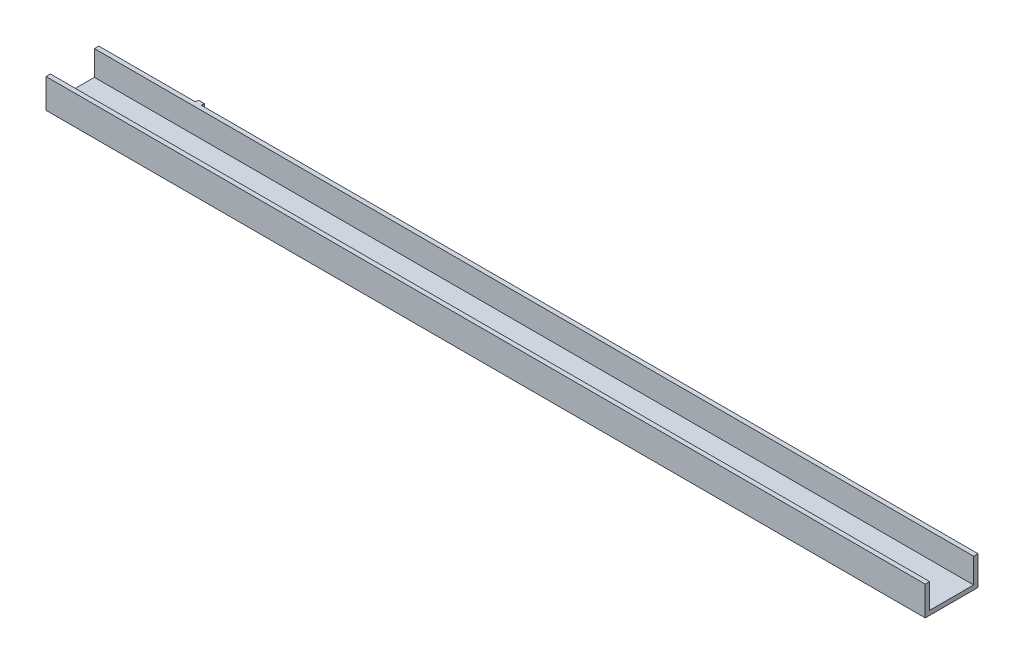
ISO-10303-21;
HEADER;
FILE_DESCRIPTION(('STEP AP214'),'2;1');
FILE_NAME('part.step','',(''),(''),'','','');
FILE_SCHEMA(('AUTOMOTIVE_DESIGN { 1 0 10303 214 1 1 1 1 }'));
ENDSEC;
DATA;
#1=APPLICATION_CONTEXT('core data for automotive mechanical design processes');
#2=APPLICATION_PROTOCOL_DEFINITION('international standard','automotive_design',2000,#1);
#3=PRODUCT_CONTEXT('',#1,'mechanical');
#4=PRODUCT('Part','Part','',(#3));
#5=PRODUCT_RELATED_PRODUCT_CATEGORY('part','',(#4));
#6=PRODUCT_DEFINITION_FORMATION('','',#4);
#7=PRODUCT_DEFINITION_CONTEXT('part definition',#1,'design');
#8=PRODUCT_DEFINITION('design','',#6,#7);
#9=PRODUCT_DEFINITION_SHAPE('','',#8);
#10=(LENGTH_UNIT() NAMED_UNIT(*) SI_UNIT(.MILLI.,.METRE.));
#11=(NAMED_UNIT(*) PLANE_ANGLE_UNIT() SI_UNIT($,.RADIAN.));
#12=(NAMED_UNIT(*) SI_UNIT($,.STERADIAN.) SOLID_ANGLE_UNIT());
#13=UNCERTAINTY_MEASURE_WITH_UNIT(LENGTH_MEASURE(1.E-05),#10,'distance_accuracy_value','');
#14=(GEOMETRIC_REPRESENTATION_CONTEXT(3) GLOBAL_UNCERTAINTY_ASSIGNED_CONTEXT((#13)) GLOBAL_UNIT_ASSIGNED_CONTEXT((#10,
#11,#12)) REPRESENTATION_CONTEXT('',''));
#15=CARTESIAN_POINT('',(0.,0.,0.));
#16=DIRECTION('',(0.,0.,1.));
#17=DIRECTION('',(1.,0.,0.));
#18=AXIS2_PLACEMENT_3D('',#15,#16,#17);
#19=CARTESIAN_POINT('',(300.,-6.42394817570351,-9.00000000000001));
#20=DIRECTION('',(0.,0.,1.));
#21=DIRECTION('',(0.,-1.,0.));
#22=AXIS2_PLACEMENT_3D('',#19,#20,#21);
#23=PLANE('',#22);
#24=DIRECTION('',(0.,-1.,0.));
#25=VECTOR('',#24,1.);
#26=CARTESIAN_POINT('',(35.,-6.42394817570351,-9.00000000000001));
#27=LINE('',#26,#25);
#28=CARTESIAN_POINT('',(35.,3.57605182429649,-9.));
#29=VERTEX_POINT('',#28);
#30=CARTESIAN_POINT('',(35.,-6.42394817570351,-9.00000000000001));
#31=VERTEX_POINT('',#30);
#32=EDGE_CURVE('E143',#29,#31,#27,.T.);
#33=ORIENTED_EDGE('',*,*,#32,.F.);
#34=DIRECTION('',(-1.,0.,0.));
#35=VECTOR('',#34,1.);
#36=CARTESIAN_POINT('',(300.,3.57605182429649,-9.));
#37=LINE('',#36,#35);
#38=CARTESIAN_POINT('',(300.,3.57605182429649,-9.));
#39=VERTEX_POINT('',#38);
#40=EDGE_CURVE('E11',#39,#29,#37,.T.);
#41=ORIENTED_EDGE('',*,*,#40,.F.);
#42=DIRECTION('',(0.,1.,0.));
#43=VECTOR('',#42,1.);
#44=CARTESIAN_POINT('',(300.,-6.42394817570351,-9.00000000000001));
#45=LINE('',#44,#43);
#46=CARTESIAN_POINT('',(300.,-6.42394817570351,-9.00000000000001));
#47=VERTEX_POINT('',#46);
#48=EDGE_CURVE('E169',#47,#39,#45,.T.);
#49=ORIENTED_EDGE('',*,*,#48,.F.);
#50=DIRECTION('',(-1.,0.,0.));
#51=VECTOR('',#50,1.);
#52=CARTESIAN_POINT('',(300.,-6.42394817570351,-9.00000000000001));
#53=LINE('',#52,#51);
#54=EDGE_CURVE('E57',#47,#31,#53,.T.);
#55=ORIENTED_EDGE('',*,*,#54,.T.);
#56=EDGE_LOOP('',(#33,#41,#49,#55));
#57=FACE_BOUND('',#56,.T.);
#58=ADVANCED_FACE('F33',(#57),#23,.F.);
#59=DIRECTION('',(0.,1.,0.));
#60=VECTOR('',#59,1.);
#61=CARTESIAN_POINT('',(33.,3.57605182429649,-9.));
#62=LINE('',#61,#60);
#63=CARTESIAN_POINT('',(33.,-6.42394817570351,-9.00000000000001));
#64=VERTEX_POINT('',#63);
#65=CARTESIAN_POINT('',(33.,3.57605182429649,-9.));
#66=VERTEX_POINT('',#65);
#67=EDGE_CURVE('E49',#64,#66,#62,.T.);
#68=ORIENTED_EDGE('',*,*,#67,.F.);
#69=CARTESIAN_POINT('',(0.,-6.42394817570351,-9.00000000000001));
#70=VERTEX_POINT('',#69);
#71=EDGE_CURVE('E147',#64,#70,#53,.T.);
#72=ORIENTED_EDGE('',*,*,#71,.T.);
#73=DIRECTION('',(0.,1.,0.));
#74=VECTOR('',#73,1.);
#75=CARTESIAN_POINT('',(0.,-6.42394817570351,-9.00000000000001));
#76=LINE('',#75,#74);
#77=CARTESIAN_POINT('',(0.,3.57605182429649,-9.));
#78=VERTEX_POINT('',#77);
#79=EDGE_CURVE('E148',#70,#78,#76,.T.);
#80=ORIENTED_EDGE('',*,*,#79,.T.);
#81=EDGE_CURVE('E41',#66,#78,#37,.T.);
#82=ORIENTED_EDGE('',*,*,#81,.F.);
#83=EDGE_LOOP('',(#68,#72,#80,#82));
#84=FACE_BOUND('',#83,.T.);
#85=ADVANCED_FACE('F239',(#84),#23,.F.);
#86=CARTESIAN_POINT('',(300.,3.57605182429649,-9.));
#87=DIRECTION('',(0.,-1.,0.));
#88=DIRECTION('',(0.,0.,-1.));
#89=AXIS2_PLACEMENT_3D('',#86,#87,#88);
#90=PLANE('',#89);
#91=DIRECTION('',(0.,0.,1.));
#92=VECTOR('',#91,1.);
#93=CARTESIAN_POINT('',(0.,3.57605182429649,-9.));
#94=LINE('',#93,#92);
#95=CARTESIAN_POINT('',(0.,3.57605182429649,-7.5));
#96=VERTEX_POINT('',#95);
#97=EDGE_CURVE('E151',#78,#96,#94,.T.);
#98=ORIENTED_EDGE('',*,*,#97,.T.);
#99=DIRECTION('',(-1.,0.,0.));
#100=VECTOR('',#99,1.);
#101=CARTESIAN_POINT('',(300.,3.57605182429649,-7.5));
#102=LINE('',#101,#100);
#103=CARTESIAN_POINT('',(300.,3.57605182429649,-7.5));
#104=VERTEX_POINT('',#103);
#105=EDGE_CURVE('E209',#104,#96,#102,.T.);
#106=ORIENTED_EDGE('',*,*,#105,.F.);
#107=DIRECTION('',(0.,0.,1.));
#108=VECTOR('',#107,1.);
#109=CARTESIAN_POINT('',(300.,3.57605182429649,-9.));
#110=LINE('',#109,#108);
#111=EDGE_CURVE('E172',#39,#104,#110,.T.);
#112=ORIENTED_EDGE('',*,*,#111,.F.);
#113=ORIENTED_EDGE('',*,*,#40,.T.);
#114=DIRECTION('',(0.,0.,1.));
#115=VECTOR('',#114,1.);
#116=CARTESIAN_POINT('',(35.,3.57605182429649,-10.));
#117=LINE('',#116,#115);
#118=CARTESIAN_POINT('',(35.,3.57605182429649,-10.));
#119=VERTEX_POINT('',#118);
#120=EDGE_CURVE('E153',#119,#29,#117,.T.);
#121=ORIENTED_EDGE('',*,*,#120,.F.);
#122=DIRECTION('',(1.,0.,0.));
#123=VECTOR('',#122,1.);
#124=CARTESIAN_POINT('',(35.,3.57605182429649,-10.));
#125=LINE('',#124,#123);
#126=CARTESIAN_POINT('',(33.,3.57605182429649,-10.));
#127=VERTEX_POINT('',#126);
#128=EDGE_CURVE('E133',#127,#119,#125,.T.);
#129=ORIENTED_EDGE('',*,*,#128,.F.);
#130=DIRECTION('',(0.,0.,1.));
#131=VECTOR('',#130,1.);
#132=CARTESIAN_POINT('',(33.,3.57605182429649,-10.));
#133=LINE('',#132,#131);
#134=EDGE_CURVE('E130',#127,#66,#133,.T.);
#135=ORIENTED_EDGE('',*,*,#134,.T.);
#136=ORIENTED_EDGE('',*,*,#81,.T.);
#137=EDGE_LOOP('',(#98,#106,#112,#113,#121,#129,#135,#136));
#138=FACE_BOUND('',#137,.T.);
#139=ADVANCED_FACE('F241',(#138),#90,.F.);
#140=CARTESIAN_POINT('',(300.,3.57605182429649,-7.5));
#141=DIRECTION('',(0.,0.,-1.));
#142=DIRECTION('',(0.,1.,0.));
#143=AXIS2_PLACEMENT_3D('',#140,#141,#142);
#144=PLANE('',#143);
#145=DIRECTION('',(0.,-1.,0.));
#146=VECTOR('',#145,1.);
#147=CARTESIAN_POINT('',(0.,3.57605182429649,-7.5));
#148=LINE('',#147,#146);
#149=CARTESIAN_POINT('',(0.,-4.92394817570351,-7.50000000000001));
#150=VERTEX_POINT('',#149);
#151=EDGE_CURVE('E188',#96,#150,#148,.T.);
#152=ORIENTED_EDGE('',*,*,#151,.T.);
#153=DIRECTION('',(-1.,0.,0.));
#154=VECTOR('',#153,1.);
#155=CARTESIAN_POINT('',(300.,-4.92394817570351,-7.50000000000001));
#156=LINE('',#155,#154);
#157=CARTESIAN_POINT('',(300.,-4.92394817570351,-7.50000000000001));
#158=VERTEX_POINT('',#157);
#159=EDGE_CURVE('E215',#158,#150,#156,.T.);
#160=ORIENTED_EDGE('',*,*,#159,.F.);
#161=DIRECTION('',(0.,-1.,0.));
#162=VECTOR('',#161,1.);
#163=CARTESIAN_POINT('',(300.,3.57605182429649,-7.5));
#164=LINE('',#163,#162);
#165=EDGE_CURVE('E175',#104,#158,#164,.T.);
#166=ORIENTED_EDGE('',*,*,#165,.F.);
#167=ORIENTED_EDGE('',*,*,#105,.T.);
#168=EDGE_LOOP('',(#152,#160,#166,#167));
#169=FACE_BOUND('',#168,.T.);
#170=ADVANCED_FACE('F276',(#169),#144,.F.);
#171=CARTESIAN_POINT('',(300.,-4.92394817570351,-7.50000000000001));
#172=DIRECTION('',(0.,-1.,0.));
#173=DIRECTION('',(0.,0.,-1.));
#174=AXIS2_PLACEMENT_3D('',#171,#172,#173);
#175=PLANE('',#174);
#176=DIRECTION('',(0.,0.,1.));
#177=VECTOR('',#176,1.);
#178=CARTESIAN_POINT('',(0.,-4.92394817570351,-7.50000000000001));
#179=LINE('',#178,#177);
#180=CARTESIAN_POINT('',(0.,-4.92394817570352,7.49999999999999));
#181=VERTEX_POINT('',#180);
#182=EDGE_CURVE('E190',#150,#181,#179,.T.);
#183=ORIENTED_EDGE('',*,*,#182,.T.);
#184=DIRECTION('',(-1.,0.,0.));
#185=VECTOR('',#184,1.);
#186=CARTESIAN_POINT('',(300.,-4.92394817570352,7.49999999999999));
#187=LINE('',#186,#185);
#188=CARTESIAN_POINT('',(300.,-4.92394817570352,7.49999999999999));
#189=VERTEX_POINT('',#188);
#190=EDGE_CURVE('E218',#189,#181,#187,.T.);
#191=ORIENTED_EDGE('',*,*,#190,.F.);
#192=DIRECTION('',(0.,0.,1.));
#193=VECTOR('',#192,1.);
#194=CARTESIAN_POINT('',(300.,-4.92394817570351,-7.50000000000001));
#195=LINE('',#194,#193);
#196=EDGE_CURVE('E177',#158,#189,#195,.T.);
#197=ORIENTED_EDGE('',*,*,#196,.F.);
#198=ORIENTED_EDGE('',*,*,#159,.T.);
#199=EDGE_LOOP('',(#183,#191,#197,#198));
#200=FACE_BOUND('',#199,.T.);
#201=ADVANCED_FACE('F280',(#200),#175,.F.);
#202=CARTESIAN_POINT('',(300.,-4.92394817570352,7.49999999999999));
#203=DIRECTION('',(0.,0.,1.));
#204=DIRECTION('',(0.,-1.,0.));
#205=AXIS2_PLACEMENT_3D('',#202,#203,#204);
#206=PLANE('',#205);
#207=DIRECTION('',(0.,1.,0.));
#208=VECTOR('',#207,1.);
#209=CARTESIAN_POINT('',(0.,-4.92394817570352,7.49999999999999));
#210=LINE('',#209,#208);
#211=CARTESIAN_POINT('',(0.,3.57605182429649,7.49999999999999));
#212=VERTEX_POINT('',#211);
#213=EDGE_CURVE('E192',#181,#212,#210,.T.);
#214=ORIENTED_EDGE('',*,*,#213,.T.);
#215=DIRECTION('',(-1.,0.,0.));
#216=VECTOR('',#215,1.);
#217=CARTESIAN_POINT('',(300.,3.57605182429649,7.49999999999999));
#218=LINE('',#217,#216);
#219=CARTESIAN_POINT('',(300.,3.57605182429649,7.49999999999999));
#220=VERTEX_POINT('',#219);
#221=EDGE_CURVE('E221',#220,#212,#218,.T.);
#222=ORIENTED_EDGE('',*,*,#221,.F.);
#223=DIRECTION('',(0.,1.,0.));
#224=VECTOR('',#223,1.);
#225=CARTESIAN_POINT('',(300.,-4.92394817570352,7.49999999999999));
#226=LINE('',#225,#224);
#227=EDGE_CURVE('E179',#189,#220,#226,.T.);
#228=ORIENTED_EDGE('',*,*,#227,.F.);
#229=ORIENTED_EDGE('',*,*,#190,.T.);
#230=EDGE_LOOP('',(#214,#222,#228,#229));
#231=FACE_BOUND('',#230,.T.);
#232=ADVANCED_FACE('F264',(#231),#206,.F.);
#233=CARTESIAN_POINT('',(300.,3.57605182429649,7.49999999999999));
#234=DIRECTION('',(0.,-1.,0.));
#235=DIRECTION('',(0.,0.,-1.));
#236=AXIS2_PLACEMENT_3D('',#233,#234,#235);
#237=PLANE('',#236);
#238=DIRECTION('',(0.,0.,1.));
#239=VECTOR('',#238,1.);
#240=CARTESIAN_POINT('',(0.,3.57605182429649,7.49999999999999));
#241=LINE('',#240,#239);
#242=CARTESIAN_POINT('',(0.,3.57605182429649,8.99999999999999));
#243=VERTEX_POINT('',#242);
#244=EDGE_CURVE('E194',#212,#243,#241,.T.);
#245=ORIENTED_EDGE('',*,*,#244,.T.);
#246=DIRECTION('',(-1.,0.,0.));
#247=VECTOR('',#246,1.);
#248=CARTESIAN_POINT('',(300.,3.57605182429649,8.99999999999999));
#249=LINE('',#248,#247);
#250=CARTESIAN_POINT('',(300.,3.57605182429649,8.99999999999999));
#251=VERTEX_POINT('',#250);
#252=EDGE_CURVE('E223',#251,#243,#249,.T.);
#253=ORIENTED_EDGE('',*,*,#252,.F.);
#254=DIRECTION('',(0.,0.,1.));
#255=VECTOR('',#254,1.);
#256=CARTESIAN_POINT('',(300.,3.57605182429649,7.49999999999999));
#257=LINE('',#256,#255);
#258=EDGE_CURVE('E181',#220,#251,#257,.T.);
#259=ORIENTED_EDGE('',*,*,#258,.F.);
#260=ORIENTED_EDGE('',*,*,#221,.T.);
#261=EDGE_LOOP('',(#245,#253,#259,#260));
#262=FACE_BOUND('',#261,.T.);
#263=ADVANCED_FACE('F256',(#262),#237,.F.);
#264=CARTESIAN_POINT('',(300.,3.57605182429649,8.99999999999999));
#265=DIRECTION('',(0.,0.,-1.));
#266=DIRECTION('',(-1.,0.,0.));
#267=AXIS2_PLACEMENT_3D('',#264,#265,#266);
#268=PLANE('',#267);
#269=DIRECTION('',(0.,-1.,0.));
#270=VECTOR('',#269,1.);
#271=CARTESIAN_POINT('',(0.,3.57605182429649,8.99999999999999));
#272=LINE('',#271,#270);
#273=CARTESIAN_POINT('',(0.,-6.42394817570351,8.99999999999999));
#274=VERTEX_POINT('',#273);
#275=EDGE_CURVE('E196',#243,#274,#272,.T.);
#276=ORIENTED_EDGE('',*,*,#275,.T.);
#277=DIRECTION('',(-1.,0.,0.));
#278=VECTOR('',#277,1.);
#279=CARTESIAN_POINT('',(300.,-6.42394817570351,8.99999999999999));
#280=LINE('',#279,#278);
#281=CARTESIAN_POINT('',(300.,-6.42394817570351,8.99999999999999));
#282=VERTEX_POINT('',#281);
#283=EDGE_CURVE('E201',#282,#274,#280,.T.);
#284=ORIENTED_EDGE('',*,*,#283,.F.);
#285=DIRECTION('',(0.,-1.,0.));
#286=VECTOR('',#285,1.);
#287=CARTESIAN_POINT('',(300.,3.57605182429649,8.99999999999999));
#288=LINE('',#287,#286);
#289=EDGE_CURVE('E183',#251,#282,#288,.T.);
#290=ORIENTED_EDGE('',*,*,#289,.F.);
#291=ORIENTED_EDGE('',*,*,#252,.T.);
#292=EDGE_LOOP('',(#276,#284,#290,#291));
#293=FACE_BOUND('',#292,.T.);
#294=ADVANCED_FACE('F254',(#293),#268,.F.);
#295=CARTESIAN_POINT('',(300.,-6.42394817570351,8.99999999999999));
#296=DIRECTION('',(0.,1.,0.));
#297=DIRECTION('',(0.,0.,1.));
#298=AXIS2_PLACEMENT_3D('',#295,#296,#297);
#299=PLANE('',#298);
#300=DIRECTION('',(0.,0.,-1.));
#301=VECTOR('',#300,1.);
#302=CARTESIAN_POINT('',(0.,-6.42394817570351,8.99999999999999));
#303=LINE('',#302,#301);
#304=EDGE_CURVE('E173',#274,#70,#303,.T.);
#305=ORIENTED_EDGE('',*,*,#304,.T.);
#306=ORIENTED_EDGE('',*,*,#71,.F.);
#307=DIRECTION('',(0.,0.,1.));
#308=VECTOR('',#307,1.);
#309=CARTESIAN_POINT('',(33.,-6.42394817570351,-10.));
#310=LINE('',#309,#308);
#311=CARTESIAN_POINT('',(33.,-6.42394817570351,-10.));
#312=VERTEX_POINT('',#311);
#313=EDGE_CURVE('E128',#312,#64,#310,.T.);
#314=ORIENTED_EDGE('',*,*,#313,.F.);
#315=DIRECTION('',(-1.,0.,0.));
#316=VECTOR('',#315,1.);
#317=CARTESIAN_POINT('',(33.,-6.42394817570351,-10.));
#318=LINE('',#317,#316);
#319=CARTESIAN_POINT('',(35.,-6.42394817570351,-10.));
#320=VERTEX_POINT('',#319);
#321=EDGE_CURVE('E134',#320,#312,#318,.T.);
#322=ORIENTED_EDGE('',*,*,#321,.F.);
#323=DIRECTION('',(0.,0.,1.));
#324=VECTOR('',#323,1.);
#325=CARTESIAN_POINT('',(35.,-6.42394817570351,-10.));
#326=LINE('',#325,#324);
#327=EDGE_CURVE('E162',#320,#31,#326,.T.);
#328=ORIENTED_EDGE('',*,*,#327,.T.);
#329=ORIENTED_EDGE('',*,*,#54,.F.);
#330=DIRECTION('',(0.,0.,-1.));
#331=VECTOR('',#330,1.);
#332=CARTESIAN_POINT('',(300.,-6.42394817570351,8.99999999999999));
#333=LINE('',#332,#331);
#334=EDGE_CURVE('E185',#282,#47,#333,.T.);
#335=ORIENTED_EDGE('',*,*,#334,.F.);
#336=ORIENTED_EDGE('',*,*,#283,.T.);
#337=EDGE_LOOP('',(#305,#306,#314,#322,#328,#329,#335,#336));
#338=FACE_BOUND('',#337,.T.);
#339=ADVANCED_FACE('F146',(#338),#299,.F.);
#340=CARTESIAN_POINT('',(300.,0.,0.));
#341=DIRECTION('',(1.,0.,0.));
#342=DIRECTION('',(0.,0.,-1.));
#343=AXIS2_PLACEMENT_3D('',#340,#341,#342);
#344=PLANE('',#343);
#345=ORIENTED_EDGE('',*,*,#48,.T.);
#346=ORIENTED_EDGE('',*,*,#111,.T.);
#347=ORIENTED_EDGE('',*,*,#165,.T.);
#348=ORIENTED_EDGE('',*,*,#196,.T.);
#349=ORIENTED_EDGE('',*,*,#227,.T.);
#350=ORIENTED_EDGE('',*,*,#258,.T.);
#351=ORIENTED_EDGE('',*,*,#289,.T.);
#352=ORIENTED_EDGE('',*,*,#334,.T.);
#353=EDGE_LOOP('',(#345,#346,#347,#348,#349,#350,#351,#352));
#354=FACE_BOUND('',#353,.T.);
#355=ADVANCED_FACE('F252',(#354),#344,.T.);
#356=CARTESIAN_POINT('',(0.,0.,0.));
#357=DIRECTION('',(1.,0.,0.));
#358=DIRECTION('',(0.,0.,-1.));
#359=AXIS2_PLACEMENT_3D('',#356,#357,#358);
#360=PLANE('',#359);
#361=ORIENTED_EDGE('',*,*,#79,.F.);
#362=ORIENTED_EDGE('',*,*,#304,.F.);
#363=ORIENTED_EDGE('',*,*,#275,.F.);
#364=ORIENTED_EDGE('',*,*,#244,.F.);
#365=ORIENTED_EDGE('',*,*,#213,.F.);
#366=ORIENTED_EDGE('',*,*,#182,.F.);
#367=ORIENTED_EDGE('',*,*,#151,.F.);
#368=ORIENTED_EDGE('',*,*,#97,.F.);
#369=EDGE_LOOP('',(#361,#362,#363,#364,#365,#366,#367,#368));
#370=FACE_BOUND('',#369,.T.);
#371=ADVANCED_FACE('F235',(#370),#360,.F.);
#372=CARTESIAN_POINT('',(33.,3.57605182429649,-10.));
#373=DIRECTION('',(1.,0.,0.));
#374=DIRECTION('',(0.,1.,0.));
#375=AXIS2_PLACEMENT_3D('',#372,#373,#374);
#376=PLANE('',#375);
#377=ORIENTED_EDGE('',*,*,#67,.T.);
#378=ORIENTED_EDGE('',*,*,#134,.F.);
#379=DIRECTION('',(0.,1.,0.));
#380=VECTOR('',#379,1.);
#381=CARTESIAN_POINT('',(33.,3.57605182429649,-10.));
#382=LINE('',#381,#380);
#383=EDGE_CURVE('E124',#312,#127,#382,.T.);
#384=ORIENTED_EDGE('',*,*,#383,.F.);
#385=ORIENTED_EDGE('',*,*,#313,.T.);
#386=EDGE_LOOP('',(#377,#378,#384,#385));
#387=FACE_BOUND('',#386,.T.);
#388=ADVANCED_FACE('F126',(#387),#376,.F.);
#389=CARTESIAN_POINT('',(35.,-6.42394817570351,-10.));
#390=DIRECTION('',(-1.,0.,0.));
#391=DIRECTION('',(0.,-1.,0.));
#392=AXIS2_PLACEMENT_3D('',#389,#390,#391);
#393=PLANE('',#392);
#394=ORIENTED_EDGE('',*,*,#32,.T.);
#395=ORIENTED_EDGE('',*,*,#327,.F.);
#396=DIRECTION('',(0.,-1.,0.));
#397=VECTOR('',#396,1.);
#398=CARTESIAN_POINT('',(35.,-6.42394817570351,-10.));
#399=LINE('',#398,#397);
#400=EDGE_CURVE('E139',#119,#320,#399,.T.);
#401=ORIENTED_EDGE('',*,*,#400,.F.);
#402=ORIENTED_EDGE('',*,*,#120,.T.);
#403=EDGE_LOOP('',(#394,#395,#401,#402));
#404=FACE_BOUND('',#403,.T.);
#405=ADVANCED_FACE('F247',(#404),#393,.F.);
#406=CARTESIAN_POINT('',(0.,0.,-10.));
#407=DIRECTION('',(0.,0.,1.));
#408=DIRECTION('',(0.,-1.,0.));
#409=AXIS2_PLACEMENT_3D('',#406,#407,#408);
#410=PLANE('',#409);
#411=ORIENTED_EDGE('',*,*,#321,.T.);
#412=ORIENTED_EDGE('',*,*,#383,.T.);
#413=ORIENTED_EDGE('',*,*,#128,.T.);
#414=ORIENTED_EDGE('',*,*,#400,.T.);
#415=EDGE_LOOP('',(#411,#412,#413,#414));
#416=FACE_BOUND('',#415,.T.);
#417=ADVANCED_FACE('F137',(#416),#410,.F.);
#418=CLOSED_SHELL('',(#58,#85,#139,#170,#201,#232,#263,#294,#339,#355,#371,#388,#405,#417));
#419=MANIFOLD_SOLID_BREP('B2',#418);
#420=ADVANCED_BREP_SHAPE_REPRESENTATION('',(#18,#419),#14);
#421=SHAPE_DEFINITION_REPRESENTATION(#9,#420);
ENDSEC;
END-ISO-10303-21;
